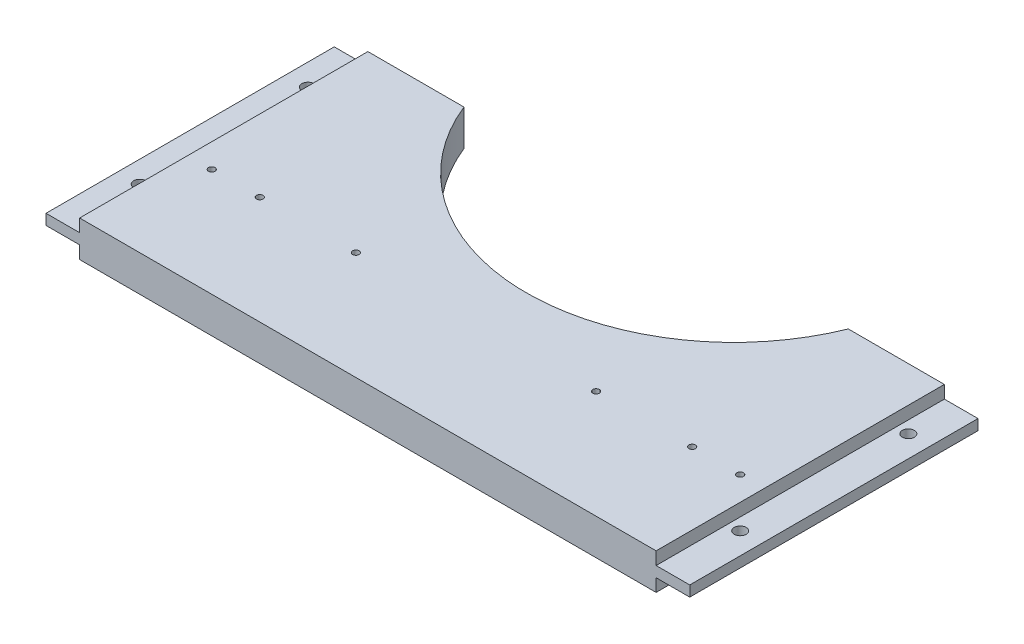
ISO-10303-21;
HEADER;
FILE_DESCRIPTION(('STEP AP214'),'2;1');
FILE_NAME('part.step','',(''),(''),'','','');
FILE_SCHEMA(('AUTOMOTIVE_DESIGN { 1 0 10303 214 1 1 1 1 }'));
ENDSEC;
DATA;
#1=APPLICATION_CONTEXT('core data for automotive mechanical design processes');
#2=APPLICATION_PROTOCOL_DEFINITION('international standard','automotive_design',2000,#1);
#3=PRODUCT_CONTEXT('',#1,'mechanical');
#4=PRODUCT('Part','Part','',(#3));
#5=PRODUCT_RELATED_PRODUCT_CATEGORY('part','',(#4));
#6=PRODUCT_DEFINITION_FORMATION('','',#4);
#7=PRODUCT_DEFINITION_CONTEXT('part definition',#1,'design');
#8=PRODUCT_DEFINITION('design','',#6,#7);
#9=PRODUCT_DEFINITION_SHAPE('','',#8);
#10=(LENGTH_UNIT() NAMED_UNIT(*) SI_UNIT(.MILLI.,.METRE.));
#11=(NAMED_UNIT(*) PLANE_ANGLE_UNIT() SI_UNIT($,.RADIAN.));
#12=(NAMED_UNIT(*) SI_UNIT($,.STERADIAN.) SOLID_ANGLE_UNIT());
#13=UNCERTAINTY_MEASURE_WITH_UNIT(LENGTH_MEASURE(1.E-05),#10,'distance_accuracy_value','');
#14=(GEOMETRIC_REPRESENTATION_CONTEXT(3) GLOBAL_UNCERTAINTY_ASSIGNED_CONTEXT((#13)) GLOBAL_UNIT_ASSIGNED_CONTEXT((#10,
#11,#12)) REPRESENTATION_CONTEXT('',''));
#15=CARTESIAN_POINT('',(0.,0.,0.));
#16=DIRECTION('',(0.,0.,1.));
#17=DIRECTION('',(1.,0.,0.));
#18=AXIS2_PLACEMENT_3D('',#15,#16,#17);
#19=CARTESIAN_POINT('',(152.4,9.525,0.));
#20=DIRECTION('',(-1.,0.,0.));
#21=DIRECTION('',(0.,0.,1.));
#22=AXIS2_PLACEMENT_3D('',#19,#20,#21);
#23=PLANE('',#22);
#24=DIRECTION('',(0.,0.,-1.));
#25=VECTOR('',#24,1.);
#26=CARTESIAN_POINT('',(152.4,-2.794,-76.2));
#27=LINE('',#26,#25);
#28=CARTESIAN_POINT('',(152.4,-2.794,76.2));
#29=VERTEX_POINT('',#28);
#30=CARTESIAN_POINT('',(152.4,-2.794,-76.2));
#31=VERTEX_POINT('',#30);
#32=EDGE_CURVE('E495',#29,#31,#27,.T.);
#33=ORIENTED_EDGE('',*,*,#32,.F.);
#34=DIRECTION('',(0.,-1.,0.));
#35=VECTOR('',#34,1.);
#36=CARTESIAN_POINT('',(152.4,9.525,76.2));
#37=LINE('',#36,#35);
#38=CARTESIAN_POINT('',(152.4,-9.525,76.2));
#39=VERTEX_POINT('',#38);
#40=EDGE_CURVE('E176',#29,#39,#37,.T.);
#41=ORIENTED_EDGE('',*,*,#40,.T.);
#42=DIRECTION('',(0.,0.,-1.));
#43=VECTOR('',#42,1.);
#44=CARTESIAN_POINT('',(152.4,-9.525,0.));
#45=LINE('',#44,#43);
#46=CARTESIAN_POINT('',(152.4,-9.525,-76.2));
#47=VERTEX_POINT('',#46);
#48=EDGE_CURVE('E323',#39,#47,#45,.T.);
#49=ORIENTED_EDGE('',*,*,#48,.T.);
#50=DIRECTION('',(0.,-1.,0.));
#51=VECTOR('',#50,1.);
#52=CARTESIAN_POINT('',(152.4,9.525,-76.2));
#53=LINE('',#52,#51);
#54=EDGE_CURVE('E345',#31,#47,#53,.T.);
#55=ORIENTED_EDGE('',*,*,#54,.F.);
#56=EDGE_LOOP('',(#33,#41,#49,#55));
#57=FACE_BOUND('',#56,.T.);
#58=ADVANCED_FACE('F47',(#57),#23,.F.);
#59=CARTESIAN_POINT('',(-152.4,9.525,0.));
#60=DIRECTION('',(1.,0.,0.));
#61=DIRECTION('',(0.,0.,-1.));
#62=AXIS2_PLACEMENT_3D('',#59,#60,#61);
#63=PLANE('',#62);
#64=DIRECTION('',(0.,0.,-1.));
#65=VECTOR('',#64,1.);
#66=CARTESIAN_POINT('',(-152.4,2.794,-76.2));
#67=LINE('',#66,#65);
#68=CARTESIAN_POINT('',(-152.4,2.794,76.2));
#69=VERTEX_POINT('',#68);
#70=CARTESIAN_POINT('',(-152.4,2.794,-76.2));
#71=VERTEX_POINT('',#70);
#72=EDGE_CURVE('E213',#69,#71,#67,.T.);
#73=ORIENTED_EDGE('',*,*,#72,.F.);
#74=DIRECTION('',(0.,-1.,0.));
#75=VECTOR('',#74,1.);
#76=CARTESIAN_POINT('',(-152.4,9.525,76.2));
#77=LINE('',#76,#75);
#78=CARTESIAN_POINT('',(-152.4,9.525,76.2));
#79=VERTEX_POINT('',#78);
#80=EDGE_CURVE('E11',#79,#69,#77,.T.);
#81=ORIENTED_EDGE('',*,*,#80,.F.);
#82=DIRECTION('',(0.,0.,1.));
#83=VECTOR('',#82,1.);
#84=CARTESIAN_POINT('',(-152.4,9.525,0.));
#85=LINE('',#84,#83);
#86=CARTESIAN_POINT('',(-152.4,9.525,-76.2));
#87=VERTEX_POINT('',#86);
#88=EDGE_CURVE('E296',#87,#79,#85,.T.);
#89=ORIENTED_EDGE('',*,*,#88,.F.);
#90=DIRECTION('',(0.,-1.,0.));
#91=VECTOR('',#90,1.);
#92=CARTESIAN_POINT('',(-152.4,9.525,-76.2));
#93=LINE('',#92,#91);
#94=EDGE_CURVE('E338',#87,#71,#93,.T.);
#95=ORIENTED_EDGE('',*,*,#94,.T.);
#96=EDGE_LOOP('',(#73,#81,#89,#95));
#97=FACE_BOUND('',#96,.T.);
#98=ADVANCED_FACE('F547',(#97),#63,.F.);
#99=CARTESIAN_POINT('',(-152.4,-2.794,76.2));
#100=VERTEX_POINT('',#99);
#101=CARTESIAN_POINT('',(-152.4,-9.525,76.2));
#102=VERTEX_POINT('',#101);
#103=EDGE_CURVE('E57',#100,#102,#77,.T.);
#104=ORIENTED_EDGE('',*,*,#103,.F.);
#105=DIRECTION('',(0.,0.,-1.));
#106=VECTOR('',#105,1.);
#107=CARTESIAN_POINT('',(-152.4,-2.794,-76.2));
#108=LINE('',#107,#106);
#109=CARTESIAN_POINT('',(-152.4,-2.794,-76.2));
#110=VERTEX_POINT('',#109);
#111=EDGE_CURVE('E73',#100,#110,#108,.T.);
#112=ORIENTED_EDGE('',*,*,#111,.T.);
#113=CARTESIAN_POINT('',(-152.4,-9.525,-76.2));
#114=VERTEX_POINT('',#113);
#115=EDGE_CURVE('E316',#110,#114,#93,.T.);
#116=ORIENTED_EDGE('',*,*,#115,.T.);
#117=DIRECTION('',(0.,0.,1.));
#118=VECTOR('',#117,1.);
#119=CARTESIAN_POINT('',(-152.4,-9.525,0.));
#120=LINE('',#119,#118);
#121=EDGE_CURVE('E295',#114,#102,#120,.T.);
#122=ORIENTED_EDGE('',*,*,#121,.T.);
#123=EDGE_LOOP('',(#104,#112,#116,#122));
#124=FACE_BOUND('',#123,.T.);
#125=ADVANCED_FACE('F49',(#124),#63,.F.);
#126=CARTESIAN_POINT('',(0.,9.525,76.2));
#127=DIRECTION('',(0.,0.,-1.));
#128=DIRECTION('',(-1.,0.,0.));
#129=AXIS2_PLACEMENT_3D('',#126,#127,#128);
#130=PLANE('',#129);
#131=DIRECTION('',(1.,0.,0.));
#132=VECTOR('',#131,1.);
#133=CARTESIAN_POINT('',(0.,-9.525,76.2));
#134=LINE('',#133,#132);
#135=EDGE_CURVE('E320',#102,#39,#134,.T.);
#136=ORIENTED_EDGE('',*,*,#135,.T.);
#137=ORIENTED_EDGE('',*,*,#40,.F.);
#138=DIRECTION('',(-1.,0.,0.));
#139=VECTOR('',#138,1.);
#140=CARTESIAN_POINT('',(152.4,-2.794,76.2));
#141=LINE('',#140,#139);
#142=CARTESIAN_POINT('',(170.18,-2.794,76.2));
#143=VERTEX_POINT('',#142);
#144=EDGE_CURVE('E490',#143,#29,#141,.T.);
#145=ORIENTED_EDGE('',*,*,#144,.F.);
#146=DIRECTION('',(0.,-1.,0.));
#147=VECTOR('',#146,1.);
#148=CARTESIAN_POINT('',(170.18,2.794,76.2));
#149=LINE('',#148,#147);
#150=CARTESIAN_POINT('',(170.18,2.794,76.2));
#151=VERTEX_POINT('',#150);
#152=EDGE_CURVE('E169',#151,#143,#149,.T.);
#153=ORIENTED_EDGE('',*,*,#152,.F.);
#154=DIRECTION('',(-1.,0.,0.));
#155=VECTOR('',#154,1.);
#156=CARTESIAN_POINT('',(152.4,2.794,76.2));
#157=LINE('',#156,#155);
#158=CARTESIAN_POINT('',(152.4,2.794,76.2));
#159=VERTEX_POINT('',#158);
#160=EDGE_CURVE('E153',#151,#159,#157,.T.);
#161=ORIENTED_EDGE('',*,*,#160,.T.);
#162=CARTESIAN_POINT('',(152.4,9.525,76.2));
#163=VERTEX_POINT('',#162);
#164=EDGE_CURVE('E166',#163,#159,#37,.T.);
#165=ORIENTED_EDGE('',*,*,#164,.F.);
#166=DIRECTION('',(1.,0.,0.));
#167=VECTOR('',#166,1.);
#168=CARTESIAN_POINT('',(0.,9.525,76.2));
#169=LINE('',#168,#167);
#170=EDGE_CURVE('E300',#79,#163,#169,.T.);
#171=ORIENTED_EDGE('',*,*,#170,.F.);
#172=ORIENTED_EDGE('',*,*,#80,.T.);
#173=DIRECTION('',(1.,0.,0.));
#174=VECTOR('',#173,1.);
#175=CARTESIAN_POINT('',(-152.4,2.794,76.2));
#176=LINE('',#175,#174);
#177=CARTESIAN_POINT('',(-170.18,2.794,76.2));
#178=VERTEX_POINT('',#177);
#179=EDGE_CURVE('E224',#178,#69,#176,.T.);
#180=ORIENTED_EDGE('',*,*,#179,.F.);
#181=DIRECTION('',(0.,-1.,0.));
#182=VECTOR('',#181,1.);
#183=CARTESIAN_POINT('',(-170.18,2.794,76.2));
#184=LINE('',#183,#182);
#185=CARTESIAN_POINT('',(-170.18,-2.794,76.2));
#186=VERTEX_POINT('',#185);
#187=EDGE_CURVE('E228',#178,#186,#184,.T.);
#188=ORIENTED_EDGE('',*,*,#187,.T.);
#189=DIRECTION('',(1.,0.,0.));
#190=VECTOR('',#189,1.);
#191=CARTESIAN_POINT('',(-152.4,-2.794,76.2));
#192=LINE('',#191,#190);
#193=EDGE_CURVE('E218',#186,#100,#192,.T.);
#194=ORIENTED_EDGE('',*,*,#193,.T.);
#195=ORIENTED_EDGE('',*,*,#103,.T.);
#196=EDGE_LOOP('',(#136,#137,#145,#153,#161,#165,#171,#172,#180,#188,#194,#195));
#197=FACE_BOUND('',#196,.T.);
#198=ADVANCED_FACE('F165',(#197),#130,.F.);
#199=ORIENTED_EDGE('',*,*,#164,.T.);
#200=DIRECTION('',(0.,0.,-1.));
#201=VECTOR('',#200,1.);
#202=CARTESIAN_POINT('',(152.4,2.794,-76.2));
#203=LINE('',#202,#201);
#204=CARTESIAN_POINT('',(152.4,2.794,-76.2));
#205=VERTEX_POINT('',#204);
#206=EDGE_CURVE('E150',#159,#205,#203,.T.);
#207=ORIENTED_EDGE('',*,*,#206,.T.);
#208=CARTESIAN_POINT('',(152.4,9.525,-76.2));
#209=VERTEX_POINT('',#208);
#210=EDGE_CURVE('E182',#209,#205,#53,.T.);
#211=ORIENTED_EDGE('',*,*,#210,.F.);
#212=DIRECTION('',(0.,0.,-1.));
#213=VECTOR('',#212,1.);
#214=CARTESIAN_POINT('',(152.4,9.525,0.));
#215=LINE('',#214,#213);
#216=EDGE_CURVE('E174',#163,#209,#215,.T.);
#217=ORIENTED_EDGE('',*,*,#216,.F.);
#218=EDGE_LOOP('',(#199,#207,#211,#217));
#219=FACE_BOUND('',#218,.T.);
#220=ADVANCED_FACE('F173',(#219),#23,.F.);
#221=CARTESIAN_POINT('',(0.,9.525,-76.2));
#222=DIRECTION('',(0.,0.,1.));
#223=DIRECTION('',(1.,0.,0.));
#224=AXIS2_PLACEMENT_3D('',#221,#222,#223);
#225=PLANE('',#224);
#226=DIRECTION('',(-1.,0.,0.));
#227=VECTOR('',#226,1.);
#228=CARTESIAN_POINT('',(0.,-9.525,-76.2));
#229=LINE('',#228,#227);
#230=CARTESIAN_POINT('',(101.6,-9.525,-76.2));
#231=VERTEX_POINT('',#230);
#232=EDGE_CURVE('E327',#47,#231,#229,.T.);
#233=ORIENTED_EDGE('',*,*,#232,.T.);
#234=DIRECTION('',(0.,-1.,0.));
#235=VECTOR('',#234,1.);
#236=CARTESIAN_POINT('',(101.6,9.525,-76.2));
#237=LINE('',#236,#235);
#238=CARTESIAN_POINT('',(101.6,9.525,-76.2));
#239=VERTEX_POINT('',#238);
#240=EDGE_CURVE('E343',#239,#231,#237,.T.);
#241=ORIENTED_EDGE('',*,*,#240,.F.);
#242=DIRECTION('',(-1.,0.,0.));
#243=VECTOR('',#242,1.);
#244=CARTESIAN_POINT('',(0.,9.525,-76.2));
#245=LINE('',#244,#243);
#246=EDGE_CURVE('E306',#209,#239,#245,.T.);
#247=ORIENTED_EDGE('',*,*,#246,.F.);
#248=ORIENTED_EDGE('',*,*,#210,.T.);
#249=DIRECTION('',(1.,0.,0.));
#250=VECTOR('',#249,1.);
#251=CARTESIAN_POINT('',(152.4,2.794,-76.2));
#252=LINE('',#251,#250);
#253=CARTESIAN_POINT('',(170.18,2.794,-76.2));
#254=VERTEX_POINT('',#253);
#255=EDGE_CURVE('E65',#205,#254,#252,.T.);
#256=ORIENTED_EDGE('',*,*,#255,.T.);
#257=DIRECTION('',(0.,-1.,0.));
#258=VECTOR('',#257,1.);
#259=CARTESIAN_POINT('',(170.18,2.794,-76.2));
#260=LINE('',#259,#258);
#261=CARTESIAN_POINT('',(170.18,-2.794,-76.2));
#262=VERTEX_POINT('',#261);
#263=EDGE_CURVE('E206',#254,#262,#260,.T.);
#264=ORIENTED_EDGE('',*,*,#263,.T.);
#265=DIRECTION('',(1.,0.,0.));
#266=VECTOR('',#265,1.);
#267=CARTESIAN_POINT('',(152.4,-2.794,-76.2));
#268=LINE('',#267,#266);
#269=EDGE_CURVE('E160',#31,#262,#268,.T.);
#270=ORIENTED_EDGE('',*,*,#269,.F.);
#271=ORIENTED_EDGE('',*,*,#54,.T.);
#272=EDGE_LOOP('',(#233,#241,#247,#248,#256,#264,#270,#271));
#273=FACE_BOUND('',#272,.T.);
#274=ADVANCED_FACE('F361',(#273),#225,.F.);
#275=CARTESIAN_POINT('',(0.,9.525,-117.169259259259));
#276=DIRECTION('',(0.,-1.,0.));
#277=DIRECTION('',(0.,0.,-1.));
#278=AXIS2_PLACEMENT_3D('',#275,#276,#277);
#279=CYLINDRICAL_SURFACE('',#278,109.549259259259);
#280=CARTESIAN_POINT('',(0.,-9.525,-117.169259259259));
#281=DIRECTION('',(0.,1.,0.));
#282=DIRECTION('',(0.,0.,1.));
#283=AXIS2_PLACEMENT_3D('',#280,#281,#282);
#284=CIRCLE('',#283,109.549259259259);
#285=CARTESIAN_POINT('',(-101.6,-9.525,-76.2));
#286=VERTEX_POINT('',#285);
#287=EDGE_CURVE('E331',#286,#231,#284,.T.);
#288=ORIENTED_EDGE('',*,*,#287,.F.);
#289=DIRECTION('',(0.,-1.,0.));
#290=VECTOR('',#289,1.);
#291=CARTESIAN_POINT('',(-101.6,9.525,-76.2));
#292=LINE('',#291,#290);
#293=CARTESIAN_POINT('',(-101.6,9.525,-76.2));
#294=VERTEX_POINT('',#293);
#295=EDGE_CURVE('E341',#294,#286,#292,.T.);
#296=ORIENTED_EDGE('',*,*,#295,.F.);
#297=CARTESIAN_POINT('',(0.,9.525,-117.169259259259));
#298=DIRECTION('',(0.,1.,0.));
#299=DIRECTION('',(0.,0.,1.));
#300=AXIS2_PLACEMENT_3D('',#297,#298,#299);
#301=CIRCLE('',#300,109.549259259259);
#302=EDGE_CURVE('E309',#294,#239,#301,.T.);
#303=ORIENTED_EDGE('',*,*,#302,.T.);
#304=ORIENTED_EDGE('',*,*,#240,.T.);
#305=EDGE_LOOP('',(#288,#296,#303,#304));
#306=FACE_BOUND('',#305,.T.);
#307=ADVANCED_FACE('F561',(#306),#279,.F.);
#308=CARTESIAN_POINT('',(0.,9.525,-76.2));
#309=DIRECTION('',(0.,0.,1.));
#310=DIRECTION('',(1.,0.,0.));
#311=AXIS2_PLACEMENT_3D('',#308,#309,#310);
#312=PLANE('',#311);
#313=DIRECTION('',(-1.,0.,0.));
#314=VECTOR('',#313,1.);
#315=CARTESIAN_POINT('',(0.,-9.525,-76.2));
#316=LINE('',#315,#314);
#317=EDGE_CURVE('E301',#286,#114,#316,.T.);
#318=ORIENTED_EDGE('',*,*,#317,.T.);
#319=ORIENTED_EDGE('',*,*,#115,.F.);
#320=DIRECTION('',(-1.,0.,0.));
#321=VECTOR('',#320,1.);
#322=CARTESIAN_POINT('',(-152.4,-2.794,-76.2));
#323=LINE('',#322,#321);
#324=CARTESIAN_POINT('',(-170.18,-2.794,-76.2));
#325=VERTEX_POINT('',#324);
#326=EDGE_CURVE('E231',#110,#325,#323,.T.);
#327=ORIENTED_EDGE('',*,*,#326,.T.);
#328=DIRECTION('',(0.,-1.,0.));
#329=VECTOR('',#328,1.);
#330=CARTESIAN_POINT('',(-170.18,2.794,-76.2));
#331=LINE('',#330,#329);
#332=CARTESIAN_POINT('',(-170.18,2.794,-76.2));
#333=VERTEX_POINT('',#332);
#334=EDGE_CURVE('E243',#333,#325,#331,.T.);
#335=ORIENTED_EDGE('',*,*,#334,.F.);
#336=DIRECTION('',(-1.,0.,0.));
#337=VECTOR('',#336,1.);
#338=CARTESIAN_POINT('',(-152.4,2.794,-76.2));
#339=LINE('',#338,#337);
#340=EDGE_CURVE('E217',#71,#333,#339,.T.);
#341=ORIENTED_EDGE('',*,*,#340,.F.);
#342=ORIENTED_EDGE('',*,*,#94,.F.);
#343=DIRECTION('',(-1.,0.,0.));
#344=VECTOR('',#343,1.);
#345=CARTESIAN_POINT('',(0.,9.525,-76.2));
#346=LINE('',#345,#344);
#347=EDGE_CURVE('E313',#294,#87,#346,.T.);
#348=ORIENTED_EDGE('',*,*,#347,.F.);
#349=ORIENTED_EDGE('',*,*,#295,.T.);
#350=EDGE_LOOP('',(#318,#319,#327,#335,#341,#342,#348,#349));
#351=FACE_BOUND('',#350,.T.);
#352=ADVANCED_FACE('F383',(#351),#312,.F.);
#353=CARTESIAN_POINT('',(0.,9.525,0.));
#354=DIRECTION('',(0.,1.,0.));
#355=DIRECTION('',(0.,0.,1.));
#356=AXIS2_PLACEMENT_3D('',#353,#354,#355);
#357=PLANE('',#356);
#358=CARTESIAN_POINT('',(139.7,9.525,19.05));
#359=DIRECTION('',(0.,1.,0.));
#360=DIRECTION('',(0.,0.,1.));
#361=AXIS2_PLACEMENT_3D('',#358,#359,#360);
#362=CIRCLE('',#361,1.72719999999998);
#363=CARTESIAN_POINT('',(139.7,9.525,20.7772));
#364=VERTEX_POINT('',#363);
#365=EDGE_CURVE('E247',#364,#364,#362,.T.);
#366=ORIENTED_EDGE('',*,*,#365,.F.);
#367=EDGE_LOOP('',(#366));
#368=FACE_BOUND('',#367,.T.);
#369=CARTESIAN_POINT('',(114.3,9.525,19.05));
#370=DIRECTION('',(0.,1.,0.));
#371=DIRECTION('',(0.,0.,1.));
#372=AXIS2_PLACEMENT_3D('',#369,#370,#371);
#373=CIRCLE('',#372,1.7272);
#374=CARTESIAN_POINT('',(114.3,9.525,20.7772));
#375=VERTEX_POINT('',#374);
#376=EDGE_CURVE('E255',#375,#375,#373,.T.);
#377=ORIENTED_EDGE('',*,*,#376,.F.);
#378=EDGE_LOOP('',(#377));
#379=FACE_BOUND('',#378,.T.);
#380=CARTESIAN_POINT('',(63.5,9.525,19.05));
#381=DIRECTION('',(0.,1.,0.));
#382=DIRECTION('',(0.,0.,1.));
#383=AXIS2_PLACEMENT_3D('',#380,#381,#382);
#384=CIRCLE('',#383,1.7272);
#385=CARTESIAN_POINT('',(63.5,9.525,20.7772));
#386=VERTEX_POINT('',#385);
#387=EDGE_CURVE('E263',#386,#386,#384,.T.);
#388=ORIENTED_EDGE('',*,*,#387,.F.);
#389=EDGE_LOOP('',(#388));
#390=FACE_BOUND('',#389,.T.);
#391=CARTESIAN_POINT('',(-139.7,9.525,19.05));
#392=DIRECTION('',(0.,1.,0.));
#393=DIRECTION('',(0.,0.,1.));
#394=AXIS2_PLACEMENT_3D('',#391,#392,#393);
#395=CIRCLE('',#394,1.72719999999998);
#396=CARTESIAN_POINT('',(-139.7,9.525,20.7772));
#397=VERTEX_POINT('',#396);
#398=EDGE_CURVE('E271',#397,#397,#395,.T.);
#399=ORIENTED_EDGE('',*,*,#398,.F.);
#400=EDGE_LOOP('',(#399));
#401=FACE_BOUND('',#400,.T.);
#402=CARTESIAN_POINT('',(-114.3,9.525,19.05));
#403=DIRECTION('',(0.,1.,0.));
#404=DIRECTION('',(0.,0.,1.));
#405=AXIS2_PLACEMENT_3D('',#402,#403,#404);
#406=CIRCLE('',#405,1.7272);
#407=CARTESIAN_POINT('',(-114.3,9.525,20.7772));
#408=VERTEX_POINT('',#407);
#409=EDGE_CURVE('E279',#408,#408,#406,.T.);
#410=ORIENTED_EDGE('',*,*,#409,.F.);
#411=EDGE_LOOP('',(#410));
#412=FACE_BOUND('',#411,.T.);
#413=CARTESIAN_POINT('',(-63.5,9.525,19.05));
#414=DIRECTION('',(0.,1.,0.));
#415=DIRECTION('',(0.,0.,1.));
#416=AXIS2_PLACEMENT_3D('',#413,#414,#415);
#417=CIRCLE('',#416,1.7272);
#418=CARTESIAN_POINT('',(-63.5,9.525,20.7772));
#419=VERTEX_POINT('',#418);
#420=EDGE_CURVE('E287',#419,#419,#417,.T.);
#421=ORIENTED_EDGE('',*,*,#420,.F.);
#422=EDGE_LOOP('',(#421));
#423=FACE_BOUND('',#422,.T.);
#424=ORIENTED_EDGE('',*,*,#88,.T.);
#425=ORIENTED_EDGE('',*,*,#170,.T.);
#426=ORIENTED_EDGE('',*,*,#216,.T.);
#427=ORIENTED_EDGE('',*,*,#246,.T.);
#428=ORIENTED_EDGE('',*,*,#302,.F.);
#429=ORIENTED_EDGE('',*,*,#347,.T.);
#430=EDGE_LOOP('',(#424,#425,#426,#427,#428,#429));
#431=FACE_BOUND('',#430,.T.);
#432=ADVANCED_FACE('F364',(#368,#379,#390,#401,#412,#423,#431),#357,.T.);
#433=CARTESIAN_POINT('',(0.,-9.525,0.));
#434=DIRECTION('',(0.,1.,0.));
#435=DIRECTION('',(0.,0.,1.));
#436=AXIS2_PLACEMENT_3D('',#433,#434,#435);
#437=PLANE('',#436);
#438=CARTESIAN_POINT('',(139.7,-9.525,19.05));
#439=DIRECTION('',(0.,1.,0.));
#440=DIRECTION('',(0.,0.,1.));
#441=AXIS2_PLACEMENT_3D('',#438,#439,#440);
#442=CIRCLE('',#441,1.72719999999998);
#443=CARTESIAN_POINT('',(139.7,-9.525,20.7772));
#444=VERTEX_POINT('',#443);
#445=EDGE_CURVE('E251',#444,#444,#442,.T.);
#446=ORIENTED_EDGE('',*,*,#445,.T.);
#447=EDGE_LOOP('',(#446));
#448=FACE_BOUND('',#447,.T.);
#449=CARTESIAN_POINT('',(114.3,-9.525,19.05));
#450=DIRECTION('',(0.,1.,0.));
#451=DIRECTION('',(0.,0.,1.));
#452=AXIS2_PLACEMENT_3D('',#449,#450,#451);
#453=CIRCLE('',#452,1.7272);
#454=CARTESIAN_POINT('',(114.3,-9.525,20.7772));
#455=VERTEX_POINT('',#454);
#456=EDGE_CURVE('E259',#455,#455,#453,.T.);
#457=ORIENTED_EDGE('',*,*,#456,.T.);
#458=EDGE_LOOP('',(#457));
#459=FACE_BOUND('',#458,.T.);
#460=CARTESIAN_POINT('',(63.5,-9.525,19.05));
#461=DIRECTION('',(0.,1.,0.));
#462=DIRECTION('',(0.,0.,1.));
#463=AXIS2_PLACEMENT_3D('',#460,#461,#462);
#464=CIRCLE('',#463,1.7272);
#465=CARTESIAN_POINT('',(63.5,-9.525,20.7772));
#466=VERTEX_POINT('',#465);
#467=EDGE_CURVE('E267',#466,#466,#464,.T.);
#468=ORIENTED_EDGE('',*,*,#467,.T.);
#469=EDGE_LOOP('',(#468));
#470=FACE_BOUND('',#469,.T.);
#471=CARTESIAN_POINT('',(-139.7,-9.525,19.05));
#472=DIRECTION('',(0.,1.,0.));
#473=DIRECTION('',(0.,0.,1.));
#474=AXIS2_PLACEMENT_3D('',#471,#472,#473);
#475=CIRCLE('',#474,1.72719999999998);
#476=CARTESIAN_POINT('',(-139.7,-9.525,20.7772));
#477=VERTEX_POINT('',#476);
#478=EDGE_CURVE('E275',#477,#477,#475,.T.);
#479=ORIENTED_EDGE('',*,*,#478,.T.);
#480=EDGE_LOOP('',(#479));
#481=FACE_BOUND('',#480,.T.);
#482=CARTESIAN_POINT('',(-114.3,-9.525,19.05));
#483=DIRECTION('',(0.,1.,0.));
#484=DIRECTION('',(0.,0.,1.));
#485=AXIS2_PLACEMENT_3D('',#482,#483,#484);
#486=CIRCLE('',#485,1.7272);
#487=CARTESIAN_POINT('',(-114.3,-9.525,20.7772));
#488=VERTEX_POINT('',#487);
#489=EDGE_CURVE('E283',#488,#488,#486,.T.);
#490=ORIENTED_EDGE('',*,*,#489,.T.);
#491=EDGE_LOOP('',(#490));
#492=FACE_BOUND('',#491,.T.);
#493=CARTESIAN_POINT('',(-63.5,-9.525,19.05));
#494=DIRECTION('',(0.,1.,0.));
#495=DIRECTION('',(0.,0.,1.));
#496=AXIS2_PLACEMENT_3D('',#493,#494,#495);
#497=CIRCLE('',#496,1.7272);
#498=CARTESIAN_POINT('',(-63.5,-9.525,20.7772));
#499=VERTEX_POINT('',#498);
#500=EDGE_CURVE('E291',#499,#499,#497,.T.);
#501=ORIENTED_EDGE('',*,*,#500,.T.);
#502=EDGE_LOOP('',(#501));
#503=FACE_BOUND('',#502,.T.);
#504=ORIENTED_EDGE('',*,*,#121,.F.);
#505=ORIENTED_EDGE('',*,*,#317,.F.);
#506=ORIENTED_EDGE('',*,*,#287,.T.);
#507=ORIENTED_EDGE('',*,*,#232,.F.);
#508=ORIENTED_EDGE('',*,*,#48,.F.);
#509=ORIENTED_EDGE('',*,*,#135,.F.);
#510=EDGE_LOOP('',(#504,#505,#506,#507,#508,#509));
#511=FACE_BOUND('',#510,.T.);
#512=ADVANCED_FACE('F572',(#448,#459,#470,#481,#492,#503,#511),#437,.F.);
#513=CARTESIAN_POINT('',(-63.5,9.525,19.05));
#514=DIRECTION('',(0.,1.,0.));
#515=DIRECTION('',(0.,0.,1.));
#516=AXIS2_PLACEMENT_3D('',#513,#514,#515);
#517=CYLINDRICAL_SURFACE('',#516,1.7272);
#518=ORIENTED_EDGE('',*,*,#500,.F.);
#519=EDGE_LOOP('',(#518));
#520=FACE_BOUND('',#519,.T.);
#521=ORIENTED_EDGE('',*,*,#420,.T.);
#522=EDGE_LOOP('',(#521));
#523=FACE_BOUND('',#522,.T.);
#524=ADVANCED_FACE('F616',(#520,#523),#517,.F.);
#525=CARTESIAN_POINT('',(-114.3,9.525,19.05));
#526=DIRECTION('',(0.,1.,0.));
#527=DIRECTION('',(0.,0.,1.));
#528=AXIS2_PLACEMENT_3D('',#525,#526,#527);
#529=CYLINDRICAL_SURFACE('',#528,1.7272);
#530=ORIENTED_EDGE('',*,*,#489,.F.);
#531=EDGE_LOOP('',(#530));
#532=FACE_BOUND('',#531,.T.);
#533=ORIENTED_EDGE('',*,*,#409,.T.);
#534=EDGE_LOOP('',(#533));
#535=FACE_BOUND('',#534,.T.);
#536=ADVANCED_FACE('F612',(#532,#535),#529,.F.);
#537=CARTESIAN_POINT('',(-139.7,9.525,19.05));
#538=DIRECTION('',(0.,1.,0.));
#539=DIRECTION('',(0.,0.,1.));
#540=AXIS2_PLACEMENT_3D('',#537,#538,#539);
#541=CYLINDRICAL_SURFACE('',#540,1.72719999999998);
#542=ORIENTED_EDGE('',*,*,#478,.F.);
#543=EDGE_LOOP('',(#542));
#544=FACE_BOUND('',#543,.T.);
#545=ORIENTED_EDGE('',*,*,#398,.T.);
#546=EDGE_LOOP('',(#545));
#547=FACE_BOUND('',#546,.T.);
#548=ADVANCED_FACE('F608',(#544,#547),#541,.F.);
#549=CARTESIAN_POINT('',(63.5,9.525,19.05));
#550=DIRECTION('',(0.,1.,0.));
#551=DIRECTION('',(0.,0.,1.));
#552=AXIS2_PLACEMENT_3D('',#549,#550,#551);
#553=CYLINDRICAL_SURFACE('',#552,1.7272);
#554=ORIENTED_EDGE('',*,*,#467,.F.);
#555=EDGE_LOOP('',(#554));
#556=FACE_BOUND('',#555,.T.);
#557=ORIENTED_EDGE('',*,*,#387,.T.);
#558=EDGE_LOOP('',(#557));
#559=FACE_BOUND('',#558,.T.);
#560=ADVANCED_FACE('F604',(#556,#559),#553,.F.);
#561=CARTESIAN_POINT('',(114.3,9.525,19.05));
#562=DIRECTION('',(0.,1.,0.));
#563=DIRECTION('',(0.,0.,1.));
#564=AXIS2_PLACEMENT_3D('',#561,#562,#563);
#565=CYLINDRICAL_SURFACE('',#564,1.7272);
#566=ORIENTED_EDGE('',*,*,#456,.F.);
#567=EDGE_LOOP('',(#566));
#568=FACE_BOUND('',#567,.T.);
#569=ORIENTED_EDGE('',*,*,#376,.T.);
#570=EDGE_LOOP('',(#569));
#571=FACE_BOUND('',#570,.T.);
#572=ADVANCED_FACE('F600',(#568,#571),#565,.F.);
#573=CARTESIAN_POINT('',(139.7,9.525,19.05));
#574=DIRECTION('',(0.,1.,0.));
#575=DIRECTION('',(0.,0.,1.));
#576=AXIS2_PLACEMENT_3D('',#573,#574,#575);
#577=CYLINDRICAL_SURFACE('',#576,1.72719999999998);
#578=ORIENTED_EDGE('',*,*,#445,.F.);
#579=EDGE_LOOP('',(#578));
#580=FACE_BOUND('',#579,.T.);
#581=ORIENTED_EDGE('',*,*,#365,.T.);
#582=EDGE_LOOP('',(#581));
#583=FACE_BOUND('',#582,.T.);
#584=ADVANCED_FACE('F597',(#580,#583),#577,.F.);
#585=CARTESIAN_POINT('',(-170.18,2.794,-76.2));
#586=DIRECTION('',(1.,0.,0.));
#587=DIRECTION('',(0.,0.,-1.));
#588=AXIS2_PLACEMENT_3D('',#585,#586,#587);
#589=PLANE('',#588);
#590=DIRECTION('',(0.,0.,1.));
#591=VECTOR('',#590,1.);
#592=CARTESIAN_POINT('',(-170.18,-2.794,-76.2));
#593=LINE('',#592,#591);
#594=EDGE_CURVE('E234',#325,#186,#593,.T.);
#595=ORIENTED_EDGE('',*,*,#594,.T.);
#596=ORIENTED_EDGE('',*,*,#187,.F.);
#597=DIRECTION('',(0.,0.,1.));
#598=VECTOR('',#597,1.);
#599=CARTESIAN_POINT('',(-170.18,2.794,-76.2));
#600=LINE('',#599,#598);
#601=EDGE_CURVE('E221',#333,#178,#600,.T.);
#602=ORIENTED_EDGE('',*,*,#601,.F.);
#603=ORIENTED_EDGE('',*,*,#334,.T.);
#604=EDGE_LOOP('',(#595,#596,#602,#603));
#605=FACE_BOUND('',#604,.T.);
#606=ADVANCED_FACE('F376',(#605),#589,.F.);
#607=CARTESIAN_POINT('',(0.,2.794,0.));
#608=DIRECTION('',(0.,-1.,0.));
#609=DIRECTION('',(0.,0.,-1.));
#610=AXIS2_PLACEMENT_3D('',#607,#608,#609);
#611=PLANE('',#610);
#612=CARTESIAN_POINT('',(-158.75,2.794,-50.8));
#613=DIRECTION('',(0.,1.,0.));
#614=DIRECTION('',(0.,0.,1.));
#615=AXIS2_PLACEMENT_3D('',#612,#613,#614);
#616=CIRCLE('',#615,3.17500000000001);
#617=CARTESIAN_POINT('',(-158.75,2.794,-47.625));
#618=VERTEX_POINT('',#617);
#619=EDGE_CURVE('E189',#618,#618,#616,.T.);
#620=ORIENTED_EDGE('',*,*,#619,.F.);
#621=EDGE_LOOP('',(#620));
#622=FACE_BOUND('',#621,.T.);
#623=CARTESIAN_POINT('',(-158.75,2.794,38.1));
#624=DIRECTION('',(0.,1.,0.));
#625=DIRECTION('',(0.,0.,1.));
#626=AXIS2_PLACEMENT_3D('',#623,#624,#625);
#627=CIRCLE('',#626,3.17500000000001);
#628=CARTESIAN_POINT('',(-158.75,2.794,41.275));
#629=VERTEX_POINT('',#628);
#630=EDGE_CURVE('E188',#629,#629,#627,.T.);
#631=ORIENTED_EDGE('',*,*,#630,.F.);
#632=EDGE_LOOP('',(#631));
#633=FACE_BOUND('',#632,.T.);
#634=ORIENTED_EDGE('',*,*,#72,.T.);
#635=ORIENTED_EDGE('',*,*,#340,.T.);
#636=ORIENTED_EDGE('',*,*,#601,.T.);
#637=ORIENTED_EDGE('',*,*,#179,.T.);
#638=EDGE_LOOP('',(#634,#635,#636,#637));
#639=FACE_BOUND('',#638,.T.);
#640=ADVANCED_FACE('F370',(#622,#633,#639),#611,.F.);
#641=CARTESIAN_POINT('',(0.,-2.794,0.));
#642=DIRECTION('',(0.,-1.,0.));
#643=DIRECTION('',(0.,0.,-1.));
#644=AXIS2_PLACEMENT_3D('',#641,#642,#643);
#645=PLANE('',#644);
#646=CARTESIAN_POINT('',(-158.75,-2.794,-50.8));
#647=DIRECTION('',(0.,-1.,0.));
#648=DIRECTION('',(0.,0.,-1.));
#649=AXIS2_PLACEMENT_3D('',#646,#647,#648);
#650=CIRCLE('',#649,3.175);
#651=CARTESIAN_POINT('',(-158.75,-2.794,-53.975));
#652=VERTEX_POINT('',#651);
#653=EDGE_CURVE('E185',#652,#652,#650,.T.);
#654=ORIENTED_EDGE('',*,*,#653,.F.);
#655=EDGE_LOOP('',(#654));
#656=FACE_BOUND('',#655,.T.);
#657=CARTESIAN_POINT('',(-158.75,-2.794,38.1));
#658=DIRECTION('',(0.,-1.,0.));
#659=DIRECTION('',(0.,0.,-1.));
#660=AXIS2_PLACEMENT_3D('',#657,#658,#659);
#661=CIRCLE('',#660,3.175);
#662=CARTESIAN_POINT('',(-158.75,-2.794,34.925));
#663=VERTEX_POINT('',#662);
#664=EDGE_CURVE('E197',#663,#663,#661,.T.);
#665=ORIENTED_EDGE('',*,*,#664,.F.);
#666=EDGE_LOOP('',(#665));
#667=FACE_BOUND('',#666,.T.);
#668=ORIENTED_EDGE('',*,*,#111,.F.);
#669=ORIENTED_EDGE('',*,*,#193,.F.);
#670=ORIENTED_EDGE('',*,*,#594,.F.);
#671=ORIENTED_EDGE('',*,*,#326,.F.);
#672=EDGE_LOOP('',(#668,#669,#670,#671));
#673=FACE_BOUND('',#672,.T.);
#674=ADVANCED_FACE('F380',(#656,#667,#673),#645,.T.);
#675=CARTESIAN_POINT('',(-158.75,2.794,38.1));
#676=DIRECTION('',(0.,1.,0.));
#677=DIRECTION('',(0.,0.,1.));
#678=AXIS2_PLACEMENT_3D('',#675,#676,#677);
#679=CYLINDRICAL_SURFACE('',#678,3.175);
#680=ORIENTED_EDGE('',*,*,#664,.T.);
#681=EDGE_LOOP('',(#680));
#682=FACE_BOUND('',#681,.T.);
#683=ORIENTED_EDGE('',*,*,#630,.T.);
#684=EDGE_LOOP('',(#683));
#685=FACE_BOUND('',#684,.T.);
#686=ADVANCED_FACE('F583',(#682,#685),#679,.F.);
#687=CARTESIAN_POINT('',(-158.75,2.794,-50.8));
#688=DIRECTION('',(0.,1.,0.));
#689=DIRECTION('',(0.,0.,1.));
#690=AXIS2_PLACEMENT_3D('',#687,#688,#689);
#691=CYLINDRICAL_SURFACE('',#690,3.175);
#692=ORIENTED_EDGE('',*,*,#653,.T.);
#693=EDGE_LOOP('',(#692));
#694=FACE_BOUND('',#693,.T.);
#695=ORIENTED_EDGE('',*,*,#619,.T.);
#696=EDGE_LOOP('',(#695));
#697=FACE_BOUND('',#696,.T.);
#698=ADVANCED_FACE('F578',(#694,#697),#691,.F.);
#699=CARTESIAN_POINT('',(170.18,2.794,-76.2));
#700=DIRECTION('',(1.,0.,0.));
#701=DIRECTION('',(0.,0.,-1.));
#702=AXIS2_PLACEMENT_3D('',#699,#700,#701);
#703=PLANE('',#702);
#704=DIRECTION('',(0.,0.,1.));
#705=VECTOR('',#704,1.);
#706=CARTESIAN_POINT('',(170.18,-2.794,-76.2));
#707=LINE('',#706,#705);
#708=EDGE_CURVE('E484',#262,#143,#707,.T.);
#709=ORIENTED_EDGE('',*,*,#708,.F.);
#710=ORIENTED_EDGE('',*,*,#263,.F.);
#711=DIRECTION('',(0.,0.,1.));
#712=VECTOR('',#711,1.);
#713=CARTESIAN_POINT('',(170.18,2.794,-76.2));
#714=LINE('',#713,#712);
#715=EDGE_CURVE('E171',#254,#151,#714,.T.);
#716=ORIENTED_EDGE('',*,*,#715,.T.);
#717=ORIENTED_EDGE('',*,*,#152,.T.);
#718=EDGE_LOOP('',(#709,#710,#716,#717));
#719=FACE_BOUND('',#718,.T.);
#720=ADVANCED_FACE('F530',(#719),#703,.T.);
#721=CARTESIAN_POINT('',(0.,2.794,0.));
#722=DIRECTION('',(0.,-1.,0.));
#723=DIRECTION('',(0.,0.,-1.));
#724=AXIS2_PLACEMENT_3D('',#721,#722,#723);
#725=PLANE('',#724);
#726=CARTESIAN_POINT('',(158.75,2.794,-50.8));
#727=DIRECTION('',(0.,1.,0.));
#728=DIRECTION('',(0.,0.,1.));
#729=AXIS2_PLACEMENT_3D('',#726,#727,#728);
#730=CIRCLE('',#729,3.17500000000001);
#731=CARTESIAN_POINT('',(158.75,2.794,-47.625));
#732=VERTEX_POINT('',#731);
#733=EDGE_CURVE('E516',#732,#732,#730,.T.);
#734=ORIENTED_EDGE('',*,*,#733,.F.);
#735=EDGE_LOOP('',(#734));
#736=FACE_BOUND('',#735,.T.);
#737=CARTESIAN_POINT('',(158.75,2.794,38.1));
#738=DIRECTION('',(0.,1.,0.));
#739=DIRECTION('',(0.,0.,1.));
#740=AXIS2_PLACEMENT_3D('',#737,#738,#739);
#741=CIRCLE('',#740,3.17500000000001);
#742=CARTESIAN_POINT('',(158.75,2.794,41.275));
#743=VERTEX_POINT('',#742);
#744=EDGE_CURVE('E505',#743,#743,#741,.T.);
#745=ORIENTED_EDGE('',*,*,#744,.F.);
#746=EDGE_LOOP('',(#745));
#747=FACE_BOUND('',#746,.T.);
#748=ORIENTED_EDGE('',*,*,#206,.F.);
#749=ORIENTED_EDGE('',*,*,#160,.F.);
#750=ORIENTED_EDGE('',*,*,#715,.F.);
#751=ORIENTED_EDGE('',*,*,#255,.F.);
#752=EDGE_LOOP('',(#748,#749,#750,#751));
#753=FACE_BOUND('',#752,.T.);
#754=ADVANCED_FACE('F152',(#736,#747,#753),#725,.F.);
#755=CARTESIAN_POINT('',(0.,-2.794,0.));
#756=DIRECTION('',(0.,-1.,0.));
#757=DIRECTION('',(0.,0.,-1.));
#758=AXIS2_PLACEMENT_3D('',#755,#756,#757);
#759=PLANE('',#758);
#760=CARTESIAN_POINT('',(158.75,-2.794,-50.8));
#761=DIRECTION('',(0.,-1.,0.));
#762=DIRECTION('',(0.,0.,-1.));
#763=AXIS2_PLACEMENT_3D('',#760,#761,#762);
#764=CIRCLE('',#763,3.175);
#765=CARTESIAN_POINT('',(158.75,-2.794,-53.975));
#766=VERTEX_POINT('',#765);
#767=EDGE_CURVE('E510',#766,#766,#764,.T.);
#768=ORIENTED_EDGE('',*,*,#767,.F.);
#769=EDGE_LOOP('',(#768));
#770=FACE_BOUND('',#769,.T.);
#771=CARTESIAN_POINT('',(158.75,-2.794,38.1));
#772=DIRECTION('',(0.,-1.,0.));
#773=DIRECTION('',(0.,0.,-1.));
#774=AXIS2_PLACEMENT_3D('',#771,#772,#773);
#775=CIRCLE('',#774,3.175);
#776=CARTESIAN_POINT('',(158.75,-2.794,34.925));
#777=VERTEX_POINT('',#776);
#778=EDGE_CURVE('E51',#777,#777,#775,.T.);
#779=ORIENTED_EDGE('',*,*,#778,.F.);
#780=EDGE_LOOP('',(#779));
#781=FACE_BOUND('',#780,.T.);
#782=ORIENTED_EDGE('',*,*,#32,.T.);
#783=ORIENTED_EDGE('',*,*,#269,.T.);
#784=ORIENTED_EDGE('',*,*,#708,.T.);
#785=ORIENTED_EDGE('',*,*,#144,.T.);
#786=EDGE_LOOP('',(#782,#783,#784,#785));
#787=FACE_BOUND('',#786,.T.);
#788=ADVANCED_FACE('F529',(#770,#781,#787),#759,.T.);
#789=CARTESIAN_POINT('',(158.75,2.794,38.1));
#790=DIRECTION('',(0.,1.,0.));
#791=DIRECTION('',(0.,0.,1.));
#792=AXIS2_PLACEMENT_3D('',#789,#790,#791);
#793=CYLINDRICAL_SURFACE('',#792,3.175);
#794=ORIENTED_EDGE('',*,*,#778,.T.);
#795=EDGE_LOOP('',(#794));
#796=FACE_BOUND('',#795,.T.);
#797=ORIENTED_EDGE('',*,*,#744,.T.);
#798=EDGE_LOOP('',(#797));
#799=FACE_BOUND('',#798,.T.);
#800=ADVANCED_FACE('F534',(#796,#799),#793,.F.);
#801=CARTESIAN_POINT('',(158.75,2.794,-50.8));
#802=DIRECTION('',(0.,1.,0.));
#803=DIRECTION('',(0.,0.,1.));
#804=AXIS2_PLACEMENT_3D('',#801,#802,#803);
#805=CYLINDRICAL_SURFACE('',#804,3.175);
#806=ORIENTED_EDGE('',*,*,#767,.T.);
#807=EDGE_LOOP('',(#806));
#808=FACE_BOUND('',#807,.T.);
#809=ORIENTED_EDGE('',*,*,#733,.T.);
#810=EDGE_LOOP('',(#809));
#811=FACE_BOUND('',#810,.T.);
#812=ADVANCED_FACE('F525',(#808,#811),#805,.F.);
#813=CLOSED_SHELL('',(#58,#98,#125,#198,#220,#274,#307,#352,#432,#512,#524,#536,#548,#560,#572,
#584,#606,#640,#674,#686,#698,#720,#754,#788,#800,#812));
#814=MANIFOLD_SOLID_BREP('B2',#813);
#815=ADVANCED_BREP_SHAPE_REPRESENTATION('',(#18,#814),#14);
#816=SHAPE_DEFINITION_REPRESENTATION(#9,#815);
ENDSEC;
END-ISO-10303-21;
